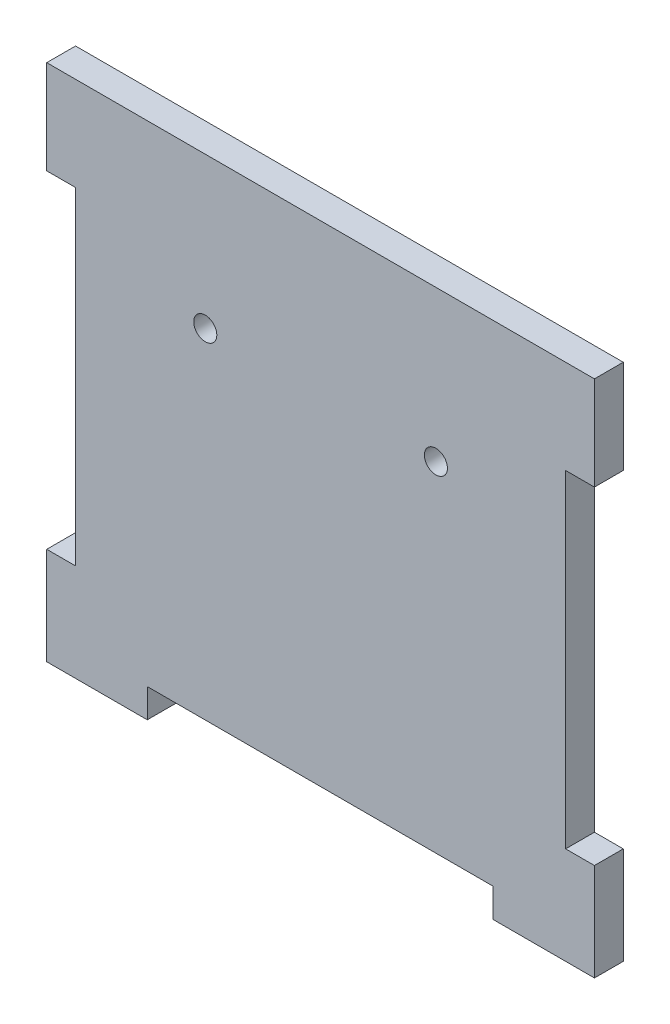
ISO-10303-21;
HEADER;
FILE_DESCRIPTION(('STEP AP214'),'2;1');
FILE_NAME('part.step','',(''),(''),'','','');
FILE_SCHEMA(('AUTOMOTIVE_DESIGN { 1 0 10303 214 1 1 1 1 }'));
ENDSEC;
DATA;
#1=APPLICATION_CONTEXT('core data for automotive mechanical design processes');
#2=APPLICATION_PROTOCOL_DEFINITION('international standard','automotive_design',2000,#1);
#3=PRODUCT_CONTEXT('',#1,'mechanical');
#4=PRODUCT('Part','Part','',(#3));
#5=PRODUCT_RELATED_PRODUCT_CATEGORY('part','',(#4));
#6=PRODUCT_DEFINITION_FORMATION('','',#4);
#7=PRODUCT_DEFINITION_CONTEXT('part definition',#1,'design');
#8=PRODUCT_DEFINITION('design','',#6,#7);
#9=PRODUCT_DEFINITION_SHAPE('','',#8);
#10=(LENGTH_UNIT() NAMED_UNIT(*) SI_UNIT(.MILLI.,.METRE.));
#11=(NAMED_UNIT(*) PLANE_ANGLE_UNIT() SI_UNIT($,.RADIAN.));
#12=(NAMED_UNIT(*) SI_UNIT($,.STERADIAN.) SOLID_ANGLE_UNIT());
#13=UNCERTAINTY_MEASURE_WITH_UNIT(LENGTH_MEASURE(1.E-05),#10,'distance_accuracy_value','');
#14=(GEOMETRIC_REPRESENTATION_CONTEXT(3) GLOBAL_UNCERTAINTY_ASSIGNED_CONTEXT((#13)) GLOBAL_UNIT_ASSIGNED_CONTEXT((#10,
#11,#12)) REPRESENTATION_CONTEXT('',''));
#15=CARTESIAN_POINT('',(0.,0.,0.));
#16=DIRECTION('',(0.,0.,1.));
#17=DIRECTION('',(1.,0.,0.));
#18=AXIS2_PLACEMENT_3D('',#15,#16,#17);
#19=CARTESIAN_POINT('',(1.77133971690412E-13,63.8192391119677,5.));
#20=DIRECTION('',(0.,1.,0.));
#21=DIRECTION('',(-1.,0.,0.));
#22=AXIS2_PLACEMENT_3D('',#19,#20,#21);
#23=PLANE('',#22);
#24=DIRECTION('',(1.,0.,0.));
#25=VECTOR('',#24,1.);
#26=CARTESIAN_POINT('',(1.77133971690412E-13,63.8192391119677,0.));
#27=LINE('',#26,#25);
#28=CARTESIAN_POINT('',(-61.3783287714673,63.8192391119679,0.));
#29=VERTEX_POINT('',#28);
#30=CARTESIAN_POINT('',(-56.3783287714673,63.8192391119679,0.));
#31=VERTEX_POINT('',#30);
#32=EDGE_CURVE('E185',#29,#31,#27,.T.);
#33=ORIENTED_EDGE('',*,*,#32,.T.);
#34=DIRECTION('',(0.,0.,-1.));
#35=VECTOR('',#34,1.);
#36=CARTESIAN_POINT('',(-56.3783287714673,63.8192391119679,5.));
#37=LINE('',#36,#35);
#38=CARTESIAN_POINT('',(-56.3783287714673,63.8192391119679,5.));
#39=VERTEX_POINT('',#38);
#40=EDGE_CURVE('E11',#39,#31,#37,.T.);
#41=ORIENTED_EDGE('',*,*,#40,.F.);
#42=DIRECTION('',(1.,0.,0.));
#43=VECTOR('',#42,1.);
#44=CARTESIAN_POINT('',(1.77133971690412E-13,63.8192391119677,5.));
#45=LINE('',#44,#43);
#46=CARTESIAN_POINT('',(-61.3783287714673,63.8192391119679,5.));
#47=VERTEX_POINT('',#46);
#48=EDGE_CURVE('E230',#47,#39,#45,.T.);
#49=ORIENTED_EDGE('',*,*,#48,.F.);
#50=DIRECTION('',(0.,0.,-1.));
#51=VECTOR('',#50,1.);
#52=CARTESIAN_POINT('',(-61.3783287714673,63.8192391119679,5.));
#53=LINE('',#52,#51);
#54=EDGE_CURVE('E184',#47,#29,#53,.T.);
#55=ORIENTED_EDGE('',*,*,#54,.T.);
#56=EDGE_LOOP('',(#33,#41,#49,#55));
#57=FACE_BOUND('',#56,.T.);
#58=ADVANCED_FACE('F35',(#57),#23,.F.);
#59=CARTESIAN_POINT('',(-56.3783287714673,0.,5.));
#60=DIRECTION('',(1.,0.,0.));
#61=DIRECTION('',(0.,1.,0.));
#62=AXIS2_PLACEMENT_3D('',#59,#60,#61);
#63=PLANE('',#62);
#64=DIRECTION('',(0.,-1.,0.));
#65=VECTOR('',#64,1.);
#66=CARTESIAN_POINT('',(-56.3783287714673,0.,0.));
#67=LINE('',#66,#65);
#68=CARTESIAN_POINT('',(-56.3783287714673,6.97713384880997,0.));
#69=VERTEX_POINT('',#68);
#70=EDGE_CURVE('E188',#31,#69,#67,.T.);
#71=ORIENTED_EDGE('',*,*,#70,.T.);
#72=DIRECTION('',(0.,0.,-1.));
#73=VECTOR('',#72,1.);
#74=CARTESIAN_POINT('',(-56.3783287714673,6.97713384880997,5.));
#75=LINE('',#74,#73);
#76=CARTESIAN_POINT('',(-56.3783287714673,6.97713384880997,5.));
#77=VERTEX_POINT('',#76);
#78=EDGE_CURVE('E43',#77,#69,#75,.T.);
#79=ORIENTED_EDGE('',*,*,#78,.F.);
#80=DIRECTION('',(0.,-1.,0.));
#81=VECTOR('',#80,1.);
#82=CARTESIAN_POINT('',(-56.3783287714673,0.,5.));
#83=LINE('',#82,#81);
#84=EDGE_CURVE('E114',#39,#77,#83,.T.);
#85=ORIENTED_EDGE('',*,*,#84,.F.);
#86=ORIENTED_EDGE('',*,*,#40,.T.);
#87=EDGE_LOOP('',(#71,#79,#85,#86));
#88=FACE_BOUND('',#87,.T.);
#89=ADVANCED_FACE('F323',(#88),#63,.F.);
#90=CARTESIAN_POINT('',(0.,6.9771338488098,5.));
#91=DIRECTION('',(0.,-1.,0.));
#92=DIRECTION('',(1.,0.,0.));
#93=AXIS2_PLACEMENT_3D('',#90,#91,#92);
#94=PLANE('',#93);
#95=DIRECTION('',(-1.,0.,0.));
#96=VECTOR('',#95,1.);
#97=CARTESIAN_POINT('',(0.,6.9771338488098,0.));
#98=LINE('',#97,#96);
#99=CARTESIAN_POINT('',(-61.3783287714673,6.97713384880997,0.));
#100=VERTEX_POINT('',#99);
#101=EDGE_CURVE('E190',#69,#100,#98,.T.);
#102=ORIENTED_EDGE('',*,*,#101,.T.);
#103=DIRECTION('',(0.,0.,-1.));
#104=VECTOR('',#103,1.);
#105=CARTESIAN_POINT('',(-61.3783287714673,6.97713384880997,5.));
#106=LINE('',#105,#104);
#107=CARTESIAN_POINT('',(-61.3783287714673,6.97713384880997,5.));
#108=VERTEX_POINT('',#107);
#109=EDGE_CURVE('E254',#108,#100,#106,.T.);
#110=ORIENTED_EDGE('',*,*,#109,.F.);
#111=DIRECTION('',(-1.,0.,0.));
#112=VECTOR('',#111,1.);
#113=CARTESIAN_POINT('',(0.,6.9771338488098,5.));
#114=LINE('',#113,#112);
#115=EDGE_CURVE('E262',#77,#108,#114,.T.);
#116=ORIENTED_EDGE('',*,*,#115,.F.);
#117=ORIENTED_EDGE('',*,*,#78,.T.);
#118=EDGE_LOOP('',(#102,#110,#116,#117));
#119=FACE_BOUND('',#118,.T.);
#120=ADVANCED_FACE('F260',(#119),#94,.F.);
#121=CARTESIAN_POINT('',(-61.3783287714673,0.,5.));
#122=DIRECTION('',(1.,0.,0.));
#123=DIRECTION('',(0.,0.,-1.));
#124=AXIS2_PLACEMENT_3D('',#121,#122,#123);
#125=PLANE('',#124);
#126=DIRECTION('',(0.,-1.,0.));
#127=VECTOR('',#126,1.);
#128=CARTESIAN_POINT('',(-61.3783287714673,0.,0.));
#129=LINE('',#128,#127);
#130=CARTESIAN_POINT('',(-61.3783287714673,-9.92165862538479,0.));
#131=VERTEX_POINT('',#130);
#132=EDGE_CURVE('E192',#100,#131,#129,.T.);
#133=ORIENTED_EDGE('',*,*,#132,.T.);
#134=DIRECTION('',(0.,0.,-1.));
#135=VECTOR('',#134,1.);
#136=CARTESIAN_POINT('',(-61.3783287714673,-9.92165862538479,5.));
#137=LINE('',#136,#135);
#138=CARTESIAN_POINT('',(-61.3783287714673,-9.92165862538479,5.));
#139=VERTEX_POINT('',#138);
#140=EDGE_CURVE('E251',#139,#131,#137,.T.);
#141=ORIENTED_EDGE('',*,*,#140,.F.);
#142=DIRECTION('',(0.,-1.,0.));
#143=VECTOR('',#142,1.);
#144=CARTESIAN_POINT('',(-61.3783287714673,0.,5.));
#145=LINE('',#144,#143);
#146=EDGE_CURVE('E281',#108,#139,#145,.T.);
#147=ORIENTED_EDGE('',*,*,#146,.F.);
#148=ORIENTED_EDGE('',*,*,#109,.T.);
#149=EDGE_LOOP('',(#133,#141,#147,#148));
#150=FACE_BOUND('',#149,.T.);
#151=ADVANCED_FACE('F271',(#150),#125,.F.);
#152=CARTESIAN_POINT('',(0.,-9.92165862538479,5.));
#153=DIRECTION('',(0.,1.,0.));
#154=DIRECTION('',(0.,0.,1.));
#155=AXIS2_PLACEMENT_3D('',#152,#153,#154);
#156=PLANE('',#155);
#157=DIRECTION('',(1.,0.,0.));
#158=VECTOR('',#157,1.);
#159=CARTESIAN_POINT('',(0.,-9.92165862538479,0.));
#160=LINE('',#159,#158);
#161=CARTESIAN_POINT('',(-43.9394540585279,-9.92165862538479,0.));
#162=VERTEX_POINT('',#161);
#163=EDGE_CURVE('E194',#131,#162,#160,.T.);
#164=ORIENTED_EDGE('',*,*,#163,.T.);
#165=DIRECTION('',(0.,0.,-1.));
#166=VECTOR('',#165,1.);
#167=CARTESIAN_POINT('',(-43.9394540585279,-9.92165862538479,5.));
#168=LINE('',#167,#166);
#169=CARTESIAN_POINT('',(-43.9394540585279,-9.92165862538479,5.));
#170=VERTEX_POINT('',#169);
#171=EDGE_CURVE('E249',#170,#162,#168,.T.);
#172=ORIENTED_EDGE('',*,*,#171,.F.);
#173=DIRECTION('',(1.,0.,0.));
#174=VECTOR('',#173,1.);
#175=CARTESIAN_POINT('',(0.,-9.92165862538479,5.));
#176=LINE('',#175,#174);
#177=EDGE_CURVE('E277',#139,#170,#176,.T.);
#178=ORIENTED_EDGE('',*,*,#177,.F.);
#179=ORIENTED_EDGE('',*,*,#140,.T.);
#180=EDGE_LOOP('',(#164,#172,#178,#179));
#181=FACE_BOUND('',#180,.T.);
#182=ADVANCED_FACE('F275',(#181),#156,.F.);
#183=CARTESIAN_POINT('',(-43.9394540585279,0.,5.));
#184=DIRECTION('',(1.,0.,0.));
#185=DIRECTION('',(0.,0.,-1.));
#186=AXIS2_PLACEMENT_3D('',#183,#184,#185);
#187=PLANE('',#186);
#188=DIRECTION('',(0.,-1.,0.));
#189=VECTOR('',#188,1.);
#190=CARTESIAN_POINT('',(-43.9394540585279,0.,0.));
#191=LINE('',#190,#189);
#192=CARTESIAN_POINT('',(-43.9394540585279,-4.92165862538477,0.));
#193=VERTEX_POINT('',#192);
#194=EDGE_CURVE('E197',#193,#162,#191,.T.);
#195=ORIENTED_EDGE('',*,*,#194,.F.);
#196=DIRECTION('',(0.,0.,-1.));
#197=VECTOR('',#196,1.);
#198=CARTESIAN_POINT('',(-43.9394540585279,-4.92165862538477,5.));
#199=LINE('',#198,#197);
#200=CARTESIAN_POINT('',(-43.9394540585279,-4.92165862538477,5.));
#201=VERTEX_POINT('',#200);
#202=EDGE_CURVE('E247',#201,#193,#199,.T.);
#203=ORIENTED_EDGE('',*,*,#202,.F.);
#204=DIRECTION('',(0.,-1.,0.));
#205=VECTOR('',#204,1.);
#206=CARTESIAN_POINT('',(-43.9394540585279,0.,5.));
#207=LINE('',#206,#205);
#208=EDGE_CURVE('E280',#201,#170,#207,.T.);
#209=ORIENTED_EDGE('',*,*,#208,.T.);
#210=ORIENTED_EDGE('',*,*,#171,.T.);
#211=EDGE_LOOP('',(#195,#203,#209,#210));
#212=FACE_BOUND('',#211,.T.);
#213=ADVANCED_FACE('F457',(#212),#187,.T.);
#214=CARTESIAN_POINT('',(0.,-4.92165862538477,5.));
#215=DIRECTION('',(0.,-1.,0.));
#216=DIRECTION('',(0.,0.,-1.));
#217=AXIS2_PLACEMENT_3D('',#214,#215,#216);
#218=PLANE('',#217);
#219=DIRECTION('',(-1.,0.,0.));
#220=VECTOR('',#219,1.);
#221=CARTESIAN_POINT('',(0.,-4.92165862538477,0.));
#222=LINE('',#221,#220);
#223=CARTESIAN_POINT('',(16.0605459414721,-4.92165862538477,0.));
#224=VERTEX_POINT('',#223);
#225=EDGE_CURVE('E200',#224,#193,#222,.T.);
#226=ORIENTED_EDGE('',*,*,#225,.F.);
#227=DIRECTION('',(0.,0.,-1.));
#228=VECTOR('',#227,1.);
#229=CARTESIAN_POINT('',(16.0605459414721,-4.92165862538477,5.));
#230=LINE('',#229,#228);
#231=CARTESIAN_POINT('',(16.0605459414721,-4.92165862538477,5.));
#232=VERTEX_POINT('',#231);
#233=EDGE_CURVE('E245',#232,#224,#230,.T.);
#234=ORIENTED_EDGE('',*,*,#233,.F.);
#235=DIRECTION('',(-1.,0.,0.));
#236=VECTOR('',#235,1.);
#237=CARTESIAN_POINT('',(0.,-4.92165862538477,5.));
#238=LINE('',#237,#236);
#239=EDGE_CURVE('E283',#232,#201,#238,.T.);
#240=ORIENTED_EDGE('',*,*,#239,.T.);
#241=ORIENTED_EDGE('',*,*,#202,.T.);
#242=EDGE_LOOP('',(#226,#234,#240,#241));
#243=FACE_BOUND('',#242,.T.);
#244=ADVANCED_FACE('F448',(#243),#218,.T.);
#245=CARTESIAN_POINT('',(16.0605459414721,0.,5.));
#246=DIRECTION('',(1.,0.,0.));
#247=DIRECTION('',(0.,1.,0.));
#248=AXIS2_PLACEMENT_3D('',#245,#246,#247);
#249=PLANE('',#248);
#250=DIRECTION('',(0.,-1.,0.));
#251=VECTOR('',#250,1.);
#252=CARTESIAN_POINT('',(16.0605459414721,0.,0.));
#253=LINE('',#252,#251);
#254=CARTESIAN_POINT('',(16.0605459414721,-9.92165862538479,0.));
#255=VERTEX_POINT('',#254);
#256=EDGE_CURVE('E203',#224,#255,#253,.T.);
#257=ORIENTED_EDGE('',*,*,#256,.T.);
#258=DIRECTION('',(0.,0.,-1.));
#259=VECTOR('',#258,1.);
#260=CARTESIAN_POINT('',(16.0605459414721,-9.92165862538479,5.));
#261=LINE('',#260,#259);
#262=CARTESIAN_POINT('',(16.0605459414721,-9.92165862538479,5.));
#263=VERTEX_POINT('',#262);
#264=EDGE_CURVE('E242',#263,#255,#261,.T.);
#265=ORIENTED_EDGE('',*,*,#264,.F.);
#266=DIRECTION('',(0.,-1.,0.));
#267=VECTOR('',#266,1.);
#268=CARTESIAN_POINT('',(16.0605459414721,0.,5.));
#269=LINE('',#268,#267);
#270=EDGE_CURVE('E290',#232,#263,#269,.T.);
#271=ORIENTED_EDGE('',*,*,#270,.F.);
#272=ORIENTED_EDGE('',*,*,#233,.T.);
#273=EDGE_LOOP('',(#257,#265,#271,#272));
#274=FACE_BOUND('',#273,.T.);
#275=ADVANCED_FACE('F439',(#274),#249,.F.);
#276=CARTESIAN_POINT('',(0.,-9.92165862538479,5.));
#277=DIRECTION('',(0.,1.,0.));
#278=DIRECTION('',(0.,0.,1.));
#279=AXIS2_PLACEMENT_3D('',#276,#277,#278);
#280=PLANE('',#279);
#281=DIRECTION('',(1.,0.,0.));
#282=VECTOR('',#281,1.);
#283=CARTESIAN_POINT('',(0.,-9.92165862538479,0.));
#284=LINE('',#283,#282);
#285=CARTESIAN_POINT('',(33.6216712285327,-9.92165862538479,0.));
#286=VERTEX_POINT('',#285);
#287=EDGE_CURVE('E205',#255,#286,#284,.T.);
#288=ORIENTED_EDGE('',*,*,#287,.T.);
#289=DIRECTION('',(0.,0.,-1.));
#290=VECTOR('',#289,1.);
#291=CARTESIAN_POINT('',(33.6216712285327,-9.92165862538479,5.));
#292=LINE('',#291,#290);
#293=CARTESIAN_POINT('',(33.6216712285327,-9.92165862538479,5.));
#294=VERTEX_POINT('',#293);
#295=EDGE_CURVE('E240',#294,#286,#292,.T.);
#296=ORIENTED_EDGE('',*,*,#295,.F.);
#297=DIRECTION('',(1.,0.,0.));
#298=VECTOR('',#297,1.);
#299=CARTESIAN_POINT('',(0.,-9.92165862538479,5.));
#300=LINE('',#299,#298);
#301=EDGE_CURVE('E292',#263,#294,#300,.T.);
#302=ORIENTED_EDGE('',*,*,#301,.F.);
#303=ORIENTED_EDGE('',*,*,#264,.T.);
#304=EDGE_LOOP('',(#288,#296,#302,#303));
#305=FACE_BOUND('',#304,.T.);
#306=ADVANCED_FACE('F430',(#305),#280,.F.);
#307=CARTESIAN_POINT('',(33.6216712285327,0.,5.));
#308=DIRECTION('',(1.,0.,0.));
#309=DIRECTION('',(0.,0.,-1.));
#310=AXIS2_PLACEMENT_3D('',#307,#308,#309);
#311=PLANE('',#310);
#312=DIRECTION('',(0.,-1.,0.));
#313=VECTOR('',#312,1.);
#314=CARTESIAN_POINT('',(33.6216712285327,0.,0.));
#315=LINE('',#314,#313);
#316=CARTESIAN_POINT('',(33.6216712285327,6.97713384880998,0.));
#317=VERTEX_POINT('',#316);
#318=EDGE_CURVE('E208',#317,#286,#315,.T.);
#319=ORIENTED_EDGE('',*,*,#318,.F.);
#320=DIRECTION('',(0.,0.,-1.));
#321=VECTOR('',#320,1.);
#322=CARTESIAN_POINT('',(33.6216712285327,6.97713384880998,5.));
#323=LINE('',#322,#321);
#324=CARTESIAN_POINT('',(33.6216712285327,6.97713384880998,5.));
#325=VERTEX_POINT('',#324);
#326=EDGE_CURVE('E238',#325,#317,#323,.T.);
#327=ORIENTED_EDGE('',*,*,#326,.F.);
#328=DIRECTION('',(0.,-1.,0.));
#329=VECTOR('',#328,1.);
#330=CARTESIAN_POINT('',(33.6216712285327,0.,5.));
#331=LINE('',#330,#329);
#332=EDGE_CURVE('E294',#325,#294,#331,.T.);
#333=ORIENTED_EDGE('',*,*,#332,.T.);
#334=ORIENTED_EDGE('',*,*,#295,.T.);
#335=EDGE_LOOP('',(#319,#327,#333,#334));
#336=FACE_BOUND('',#335,.T.);
#337=ADVANCED_FACE('F422',(#336),#311,.T.);
#338=CARTESIAN_POINT('',(0.,6.97713384880988,5.));
#339=DIRECTION('',(0.,1.,0.));
#340=DIRECTION('',(-1.,0.,0.));
#341=AXIS2_PLACEMENT_3D('',#338,#339,#340);
#342=PLANE('',#341);
#343=DIRECTION('',(1.,0.,0.));
#344=VECTOR('',#343,1.);
#345=CARTESIAN_POINT('',(0.,6.97713384880988,0.));
#346=LINE('',#345,#344);
#347=CARTESIAN_POINT('',(28.6216712285327,6.97713384880997,0.));
#348=VERTEX_POINT('',#347);
#349=EDGE_CURVE('E211',#348,#317,#346,.T.);
#350=ORIENTED_EDGE('',*,*,#349,.F.);
#351=DIRECTION('',(0.,0.,-1.));
#352=VECTOR('',#351,1.);
#353=CARTESIAN_POINT('',(28.6216712285327,6.97713384880997,5.));
#354=LINE('',#353,#352);
#355=CARTESIAN_POINT('',(28.6216712285327,6.97713384880997,5.));
#356=VERTEX_POINT('',#355);
#357=EDGE_CURVE('E236',#356,#348,#354,.T.);
#358=ORIENTED_EDGE('',*,*,#357,.F.);
#359=DIRECTION('',(1.,0.,0.));
#360=VECTOR('',#359,1.);
#361=CARTESIAN_POINT('',(0.,6.97713384880988,5.));
#362=LINE('',#361,#360);
#363=EDGE_CURVE('E297',#356,#325,#362,.T.);
#364=ORIENTED_EDGE('',*,*,#363,.T.);
#365=ORIENTED_EDGE('',*,*,#326,.T.);
#366=EDGE_LOOP('',(#350,#358,#364,#365));
#367=FACE_BOUND('',#366,.T.);
#368=ADVANCED_FACE('F309',(#367),#342,.T.);
#369=CARTESIAN_POINT('',(28.6216712285328,0.,5.));
#370=DIRECTION('',(1.,0.,0.));
#371=DIRECTION('',(0.,1.,0.));
#372=AXIS2_PLACEMENT_3D('',#369,#370,#371);
#373=PLANE('',#372);
#374=DIRECTION('',(0.,-1.,0.));
#375=VECTOR('',#374,1.);
#376=CARTESIAN_POINT('',(28.6216712285328,0.,0.));
#377=LINE('',#376,#375);
#378=CARTESIAN_POINT('',(28.6216712285327,63.8192391119679,0.));
#379=VERTEX_POINT('',#378);
#380=EDGE_CURVE('E214',#379,#348,#377,.T.);
#381=ORIENTED_EDGE('',*,*,#380,.F.);
#382=DIRECTION('',(0.,0.,-1.));
#383=VECTOR('',#382,1.);
#384=CARTESIAN_POINT('',(28.6216712285327,63.8192391119679,5.));
#385=LINE('',#384,#383);
#386=CARTESIAN_POINT('',(28.6216712285327,63.8192391119679,5.));
#387=VERTEX_POINT('',#386);
#388=EDGE_CURVE('E234',#387,#379,#385,.T.);
#389=ORIENTED_EDGE('',*,*,#388,.F.);
#390=DIRECTION('',(0.,-1.,0.));
#391=VECTOR('',#390,1.);
#392=CARTESIAN_POINT('',(28.6216712285328,0.,5.));
#393=LINE('',#392,#391);
#394=EDGE_CURVE('E300',#387,#356,#393,.T.);
#395=ORIENTED_EDGE('',*,*,#394,.T.);
#396=ORIENTED_EDGE('',*,*,#357,.T.);
#397=EDGE_LOOP('',(#381,#389,#395,#396));
#398=FACE_BOUND('',#397,.T.);
#399=ADVANCED_FACE('F304',(#398),#373,.T.);
#400=CARTESIAN_POINT('',(-1.77133971690413E-13,63.8192391119678,5.));
#401=DIRECTION('',(0.,1.,0.));
#402=DIRECTION('',(-1.,0.,0.));
#403=AXIS2_PLACEMENT_3D('',#400,#401,#402);
#404=PLANE('',#403);
#405=DIRECTION('',(1.,0.,0.));
#406=VECTOR('',#405,1.);
#407=CARTESIAN_POINT('',(-1.77133971690413E-13,63.8192391119678,0.));
#408=LINE('',#407,#406);
#409=CARTESIAN_POINT('',(33.6216712285327,63.8192391119679,0.));
#410=VERTEX_POINT('',#409);
#411=EDGE_CURVE('E217',#379,#410,#408,.T.);
#412=ORIENTED_EDGE('',*,*,#411,.T.);
#413=DIRECTION('',(0.,0.,-1.));
#414=VECTOR('',#413,1.);
#415=CARTESIAN_POINT('',(33.6216712285327,63.8192391119679,5.));
#416=LINE('',#415,#414);
#417=CARTESIAN_POINT('',(33.6216712285327,63.8192391119679,5.));
#418=VERTEX_POINT('',#417);
#419=EDGE_CURVE('E163',#418,#410,#416,.T.);
#420=ORIENTED_EDGE('',*,*,#419,.F.);
#421=DIRECTION('',(1.,0.,0.));
#422=VECTOR('',#421,1.);
#423=CARTESIAN_POINT('',(-1.77133971690413E-13,63.8192391119678,5.));
#424=LINE('',#423,#422);
#425=EDGE_CURVE('E170',#387,#418,#424,.T.);
#426=ORIENTED_EDGE('',*,*,#425,.F.);
#427=ORIENTED_EDGE('',*,*,#388,.T.);
#428=EDGE_LOOP('',(#412,#420,#426,#427));
#429=FACE_BOUND('',#428,.T.);
#430=ADVANCED_FACE('F313',(#429),#404,.F.);
#431=CARTESIAN_POINT('',(33.6216712285327,0.,5.));
#432=DIRECTION('',(1.,0.,0.));
#433=DIRECTION('',(0.,0.,-1.));
#434=AXIS2_PLACEMENT_3D('',#431,#432,#433);
#435=PLANE('',#434);
#436=DIRECTION('',(0.,-1.,0.));
#437=VECTOR('',#436,1.);
#438=CARTESIAN_POINT('',(33.6216712285327,0.,0.));
#439=LINE('',#438,#437);
#440=CARTESIAN_POINT('',(33.6216712285327,80.0783413746152,0.));
#441=VERTEX_POINT('',#440);
#442=EDGE_CURVE('E158',#441,#410,#439,.T.);
#443=ORIENTED_EDGE('',*,*,#442,.F.);
#444=DIRECTION('',(0.,0.,-1.));
#445=VECTOR('',#444,1.);
#446=CARTESIAN_POINT('',(33.6216712285327,80.0783413746152,5.));
#447=LINE('',#446,#445);
#448=CARTESIAN_POINT('',(33.6216712285327,80.0783413746152,5.));
#449=VERTEX_POINT('',#448);
#450=EDGE_CURVE('E153',#449,#441,#447,.T.);
#451=ORIENTED_EDGE('',*,*,#450,.F.);
#452=DIRECTION('',(0.,-1.,0.));
#453=VECTOR('',#452,1.);
#454=CARTESIAN_POINT('',(33.6216712285327,0.,5.));
#455=LINE('',#454,#453);
#456=EDGE_CURVE('E156',#449,#418,#455,.T.);
#457=ORIENTED_EDGE('',*,*,#456,.T.);
#458=ORIENTED_EDGE('',*,*,#419,.T.);
#459=EDGE_LOOP('',(#443,#451,#457,#458));
#460=FACE_BOUND('',#459,.T.);
#461=ADVANCED_FACE('F155',(#460),#435,.T.);
#462=CARTESIAN_POINT('',(0.,80.0783413746152,5.));
#463=DIRECTION('',(0.,1.,0.));
#464=DIRECTION('',(0.,0.,1.));
#465=AXIS2_PLACEMENT_3D('',#462,#463,#464);
#466=PLANE('',#465);
#467=DIRECTION('',(1.,0.,0.));
#468=VECTOR('',#467,1.);
#469=CARTESIAN_POINT('',(0.,80.0783413746152,0.));
#470=LINE('',#469,#468);
#471=CARTESIAN_POINT('',(-61.3783287714673,80.0783413746152,0.));
#472=VERTEX_POINT('',#471);
#473=EDGE_CURVE('E221',#472,#441,#470,.T.);
#474=ORIENTED_EDGE('',*,*,#473,.F.);
#475=DIRECTION('',(0.,0.,-1.));
#476=VECTOR('',#475,1.);
#477=CARTESIAN_POINT('',(-61.3783287714673,80.0783413746152,5.));
#478=LINE('',#477,#476);
#479=CARTESIAN_POINT('',(-61.3783287714673,80.0783413746152,5.));
#480=VERTEX_POINT('',#479);
#481=EDGE_CURVE('E103',#480,#472,#478,.T.);
#482=ORIENTED_EDGE('',*,*,#481,.F.);
#483=DIRECTION('',(1.,0.,0.));
#484=VECTOR('',#483,1.);
#485=CARTESIAN_POINT('',(0.,80.0783413746152,5.));
#486=LINE('',#485,#484);
#487=EDGE_CURVE('E167',#480,#449,#486,.T.);
#488=ORIENTED_EDGE('',*,*,#487,.T.);
#489=ORIENTED_EDGE('',*,*,#450,.T.);
#490=EDGE_LOOP('',(#474,#482,#488,#489));
#491=FACE_BOUND('',#490,.T.);
#492=ADVANCED_FACE('F173',(#491),#466,.T.);
#493=CARTESIAN_POINT('',(6.12167122853269,53.9018707863799,5.));
#494=DIRECTION('',(0.,0.,-1.));
#495=DIRECTION('',(-1.,0.,0.));
#496=AXIS2_PLACEMENT_3D('',#493,#494,#495);
#497=CYLINDRICAL_SURFACE('',#496,2.);
#498=CARTESIAN_POINT('',(6.12167122853269,53.9018707863799,5.));
#499=DIRECTION('',(0.,0.,1.));
#500=DIRECTION('',(1.,0.,0.));
#501=AXIS2_PLACEMENT_3D('',#498,#499,#500);
#502=CIRCLE('',#501,2.);
#503=CARTESIAN_POINT('',(8.12167122853269,53.9018707863799,5.));
#504=VERTEX_POINT('',#503);
#505=EDGE_CURVE('E175',#504,#504,#502,.T.);
#506=ORIENTED_EDGE('',*,*,#505,.T.);
#507=EDGE_LOOP('',(#506));
#508=FACE_BOUND('',#507,.T.);
#509=CARTESIAN_POINT('',(6.12167122853269,53.9018707863799,0.));
#510=DIRECTION('',(0.,0.,1.));
#511=DIRECTION('',(1.,0.,0.));
#512=AXIS2_PLACEMENT_3D('',#509,#510,#511);
#513=CIRCLE('',#512,2.);
#514=CARTESIAN_POINT('',(8.12167122853269,53.9018707863799,0.));
#515=VERTEX_POINT('',#514);
#516=EDGE_CURVE('E224',#515,#515,#513,.T.);
#517=ORIENTED_EDGE('',*,*,#516,.F.);
#518=EDGE_LOOP('',(#517));
#519=FACE_BOUND('',#518,.T.);
#520=ADVANCED_FACE('F333',(#508,#519),#497,.F.);
#521=CARTESIAN_POINT('',(-61.3783287714673,0.,5.));
#522=DIRECTION('',(1.,0.,0.));
#523=DIRECTION('',(0.,0.,-1.));
#524=AXIS2_PLACEMENT_3D('',#521,#522,#523);
#525=PLANE('',#524);
#526=DIRECTION('',(0.,-1.,0.));
#527=VECTOR('',#526,1.);
#528=CARTESIAN_POINT('',(-61.3783287714673,0.,0.));
#529=LINE('',#528,#527);
#530=EDGE_CURVE('E106',#472,#29,#529,.T.);
#531=ORIENTED_EDGE('',*,*,#530,.T.);
#532=ORIENTED_EDGE('',*,*,#54,.F.);
#533=DIRECTION('',(0.,-1.,0.));
#534=VECTOR('',#533,1.);
#535=CARTESIAN_POINT('',(-61.3783287714673,0.,5.));
#536=LINE('',#535,#534);
#537=EDGE_CURVE('E51',#480,#47,#536,.T.);
#538=ORIENTED_EDGE('',*,*,#537,.F.);
#539=ORIENTED_EDGE('',*,*,#481,.T.);
#540=EDGE_LOOP('',(#531,#532,#538,#539));
#541=FACE_BOUND('',#540,.T.);
#542=ADVANCED_FACE('F330',(#541),#525,.F.);
#543=CARTESIAN_POINT('',(-33.8783287714673,53.9018707863799,5.));
#544=DIRECTION('',(0.,0.,-1.));
#545=DIRECTION('',(-1.,0.,0.));
#546=AXIS2_PLACEMENT_3D('',#543,#544,#545);
#547=CYLINDRICAL_SURFACE('',#546,2.);
#548=CARTESIAN_POINT('',(-33.8783287714673,53.9018707863799,5.));
#549=DIRECTION('',(0.,0.,1.));
#550=DIRECTION('',(1.,0.,0.));
#551=AXIS2_PLACEMENT_3D('',#548,#549,#550);
#552=CIRCLE('',#551,2.);
#553=CARTESIAN_POINT('',(-31.8783287714672,53.9018707863799,5.));
#554=VERTEX_POINT('',#553);
#555=EDGE_CURVE('E181',#554,#554,#552,.T.);
#556=ORIENTED_EDGE('',*,*,#555,.T.);
#557=EDGE_LOOP('',(#556));
#558=FACE_BOUND('',#557,.T.);
#559=CARTESIAN_POINT('',(-33.8783287714673,53.9018707863799,0.));
#560=DIRECTION('',(0.,0.,1.));
#561=DIRECTION('',(1.,0.,0.));
#562=AXIS2_PLACEMENT_3D('',#559,#560,#561);
#563=CIRCLE('',#562,2.);
#564=CARTESIAN_POINT('',(-31.8783287714672,53.9018707863799,0.));
#565=VERTEX_POINT('',#564);
#566=EDGE_CURVE('E227',#565,#565,#563,.T.);
#567=ORIENTED_EDGE('',*,*,#566,.F.);
#568=EDGE_LOOP('',(#567));
#569=FACE_BOUND('',#568,.T.);
#570=ADVANCED_FACE('F332',(#558,#569),#547,.F.);
#571=CARTESIAN_POINT('',(0.,0.,5.));
#572=DIRECTION('',(0.,0.,1.));
#573=DIRECTION('',(1.,0.,0.));
#574=AXIS2_PLACEMENT_3D('',#571,#572,#573);
#575=PLANE('',#574);
#576=ORIENTED_EDGE('',*,*,#48,.T.);
#577=ORIENTED_EDGE('',*,*,#84,.T.);
#578=ORIENTED_EDGE('',*,*,#115,.T.);
#579=ORIENTED_EDGE('',*,*,#146,.T.);
#580=ORIENTED_EDGE('',*,*,#177,.T.);
#581=ORIENTED_EDGE('',*,*,#208,.F.);
#582=ORIENTED_EDGE('',*,*,#239,.F.);
#583=ORIENTED_EDGE('',*,*,#270,.T.);
#584=ORIENTED_EDGE('',*,*,#301,.T.);
#585=ORIENTED_EDGE('',*,*,#332,.F.);
#586=ORIENTED_EDGE('',*,*,#363,.F.);
#587=ORIENTED_EDGE('',*,*,#394,.F.);
#588=ORIENTED_EDGE('',*,*,#425,.T.);
#589=ORIENTED_EDGE('',*,*,#456,.F.);
#590=ORIENTED_EDGE('',*,*,#487,.F.);
#591=ORIENTED_EDGE('',*,*,#537,.T.);
#592=EDGE_LOOP('',(#576,#577,#578,#579,#580,#581,#582,#583,#584,#585,#586,#587,#588,#589,#590,#591));
#593=FACE_BOUND('',#592,.T.);
#594=ORIENTED_EDGE('',*,*,#505,.F.);
#595=EDGE_LOOP('',(#594));
#596=FACE_BOUND('',#595,.T.);
#597=ORIENTED_EDGE('',*,*,#555,.F.);
#598=EDGE_LOOP('',(#597));
#599=FACE_BOUND('',#598,.T.);
#600=ADVANCED_FACE('F165',(#593,#596,#599),#575,.T.);
#601=CARTESIAN_POINT('',(0.,0.,0.));
#602=DIRECTION('',(0.,0.,1.));
#603=DIRECTION('',(1.,0.,0.));
#604=AXIS2_PLACEMENT_3D('',#601,#602,#603);
#605=PLANE('',#604);
#606=ORIENTED_EDGE('',*,*,#32,.F.);
#607=ORIENTED_EDGE('',*,*,#530,.F.);
#608=ORIENTED_EDGE('',*,*,#473,.T.);
#609=ORIENTED_EDGE('',*,*,#442,.T.);
#610=ORIENTED_EDGE('',*,*,#411,.F.);
#611=ORIENTED_EDGE('',*,*,#380,.T.);
#612=ORIENTED_EDGE('',*,*,#349,.T.);
#613=ORIENTED_EDGE('',*,*,#318,.T.);
#614=ORIENTED_EDGE('',*,*,#287,.F.);
#615=ORIENTED_EDGE('',*,*,#256,.F.);
#616=ORIENTED_EDGE('',*,*,#225,.T.);
#617=ORIENTED_EDGE('',*,*,#194,.T.);
#618=ORIENTED_EDGE('',*,*,#163,.F.);
#619=ORIENTED_EDGE('',*,*,#132,.F.);
#620=ORIENTED_EDGE('',*,*,#101,.F.);
#621=ORIENTED_EDGE('',*,*,#70,.F.);
#622=EDGE_LOOP('',(#606,#607,#608,#609,#610,#611,#612,#613,#614,#615,#616,#617,#618,#619,#620,#621));
#623=FACE_BOUND('',#622,.T.);
#624=ORIENTED_EDGE('',*,*,#516,.T.);
#625=EDGE_LOOP('',(#624));
#626=FACE_BOUND('',#625,.T.);
#627=ORIENTED_EDGE('',*,*,#566,.T.);
#628=EDGE_LOOP('',(#627));
#629=FACE_BOUND('',#628,.T.);
#630=ADVANCED_FACE('F266',(#623,#626,#629),#605,.F.);
#631=CLOSED_SHELL('',(#58,#89,#120,#151,#182,#213,#244,#275,#306,#337,#368,#399,#430,#461,#492,
#520,#542,#570,#600,#630));
#632=MANIFOLD_SOLID_BREP('B2',#631);
#633=ADVANCED_BREP_SHAPE_REPRESENTATION('',(#18,#632),#14);
#634=SHAPE_DEFINITION_REPRESENTATION(#9,#633);
ENDSEC;
END-ISO-10303-21;
